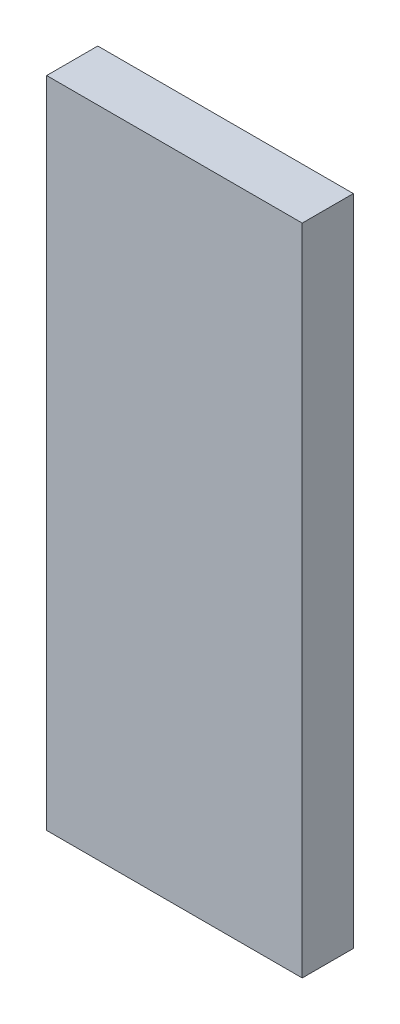
ISO-10303-21;
HEADER;
FILE_DESCRIPTION(('STEP AP214'),'2;1');
FILE_NAME('part.step','',(''),(''),'','','');
FILE_SCHEMA(('AUTOMOTIVE_DESIGN { 1 0 10303 214 1 1 1 1 }'));
ENDSEC;
DATA;
#1=APPLICATION_CONTEXT('core data for automotive mechanical design processes');
#2=APPLICATION_PROTOCOL_DEFINITION('international standard','automotive_design',2000,#1);
#3=PRODUCT_CONTEXT('',#1,'mechanical');
#4=PRODUCT('Part','Part','',(#3));
#5=PRODUCT_RELATED_PRODUCT_CATEGORY('part','',(#4));
#6=PRODUCT_DEFINITION_FORMATION('','',#4);
#7=PRODUCT_DEFINITION_CONTEXT('part definition',#1,'design');
#8=PRODUCT_DEFINITION('design','',#6,#7);
#9=PRODUCT_DEFINITION_SHAPE('','',#8);
#10=(LENGTH_UNIT() NAMED_UNIT(*) SI_UNIT(.MILLI.,.METRE.));
#11=(NAMED_UNIT(*) PLANE_ANGLE_UNIT() SI_UNIT($,.RADIAN.));
#12=(NAMED_UNIT(*) SI_UNIT($,.STERADIAN.) SOLID_ANGLE_UNIT());
#13=UNCERTAINTY_MEASURE_WITH_UNIT(LENGTH_MEASURE(1.E-05),#10,'distance_accuracy_value','');
#14=(GEOMETRIC_REPRESENTATION_CONTEXT(3) GLOBAL_UNCERTAINTY_ASSIGNED_CONTEXT((#13)) GLOBAL_UNIT_ASSIGNED_CONTEXT((#10,
#11,#12)) REPRESENTATION_CONTEXT('',''));
#15=CARTESIAN_POINT('',(0.,0.,0.));
#16=DIRECTION('',(0.,0.,1.));
#17=DIRECTION('',(1.,0.,0.));
#18=AXIS2_PLACEMENT_3D('',#15,#16,#17);
#19=CARTESIAN_POINT('',(0.67499992,-1.72667676,0.));
#20=DIRECTION('',(-1.,0.,0.));
#21=DIRECTION('',(0.,1.,0.));
#22=AXIS2_PLACEMENT_3D('',#19,#20,#21);
#23=PLANE('',#22);
#24=DIRECTION('',(0.,1.,0.));
#25=VECTOR('',#24,1.);
#26=CARTESIAN_POINT('',(0.67499992,-1.72667676,0.));
#27=LINE('',#26,#25);
#28=CARTESIAN_POINT('',(0.67499992,-1.72667676,0.));
#29=VERTEX_POINT('',#28);
#30=CARTESIAN_POINT('',(0.67499992,1.7266793,0.));
#31=VERTEX_POINT('',#30);
#32=EDGE_CURVE('E11',#29,#31,#27,.T.);
#33=ORIENTED_EDGE('',*,*,#32,.T.);
#34=DIRECTION('',(0.,0.,1.));
#35=VECTOR('',#34,1.);
#36=CARTESIAN_POINT('',(0.67499992,1.7266793,0.));
#37=LINE('',#36,#35);
#38=CARTESIAN_POINT('',(0.67499992,1.7266793,0.26999946));
#39=VERTEX_POINT('',#38);
#40=EDGE_CURVE('E24',#31,#39,#37,.T.);
#41=ORIENTED_EDGE('',*,*,#40,.T.);
#42=DIRECTION('',(0.,1.,0.));
#43=VECTOR('',#42,1.);
#44=CARTESIAN_POINT('',(0.67499992,-1.72667676,0.26999946));
#45=LINE('',#44,#43);
#46=CARTESIAN_POINT('',(0.67499992,-1.72667676,0.26999946));
#47=VERTEX_POINT('',#46);
#48=EDGE_CURVE('E87',#47,#39,#45,.T.);
#49=ORIENTED_EDGE('',*,*,#48,.F.);
#50=DIRECTION('',(0.,0.,1.));
#51=VECTOR('',#50,1.);
#52=CARTESIAN_POINT('',(0.67499992,-1.72667676,0.));
#53=LINE('',#52,#51);
#54=EDGE_CURVE('E36',#29,#47,#53,.T.);
#55=ORIENTED_EDGE('',*,*,#54,.F.);
#56=EDGE_LOOP('',(#33,#41,#49,#55));
#57=FACE_BOUND('',#56,.T.);
#58=ADVANCED_FACE('F17',(#57),#23,.F.);
#59=CARTESIAN_POINT('',(0.67499992,1.7266793,0.));
#60=DIRECTION('',(0.,-1.,0.));
#61=DIRECTION('',(-1.,0.,0.));
#62=AXIS2_PLACEMENT_3D('',#59,#60,#61);
#63=PLANE('',#62);
#64=DIRECTION('',(-1.,0.,0.));
#65=VECTOR('',#64,1.);
#66=CARTESIAN_POINT('',(0.67499992,1.7266793,0.));
#67=LINE('',#66,#65);
#68=CARTESIAN_POINT('',(-0.67499992,1.7266793,0.));
#69=VERTEX_POINT('',#68);
#70=EDGE_CURVE('E84',#31,#69,#67,.T.);
#71=ORIENTED_EDGE('',*,*,#70,.T.);
#72=DIRECTION('',(0.,0.,1.));
#73=VECTOR('',#72,1.);
#74=CARTESIAN_POINT('',(-0.67499992,1.7266793,0.));
#75=LINE('',#74,#73);
#76=CARTESIAN_POINT('',(-0.67499992,1.7266793,0.26999946));
#77=VERTEX_POINT('',#76);
#78=EDGE_CURVE('E82',#69,#77,#75,.T.);
#79=ORIENTED_EDGE('',*,*,#78,.T.);
#80=DIRECTION('',(-1.,0.,0.));
#81=VECTOR('',#80,1.);
#82=CARTESIAN_POINT('',(0.67499992,1.7266793,0.26999946));
#83=LINE('',#82,#81);
#84=EDGE_CURVE('E62',#39,#77,#83,.T.);
#85=ORIENTED_EDGE('',*,*,#84,.F.);
#86=ORIENTED_EDGE('',*,*,#40,.F.);
#87=EDGE_LOOP('',(#71,#79,#85,#86));
#88=FACE_BOUND('',#87,.T.);
#89=ADVANCED_FACE('F89',(#88),#63,.F.);
#90=CARTESIAN_POINT('',(-0.67499992,1.7266793,0.));
#91=DIRECTION('',(1.,0.,0.));
#92=DIRECTION('',(0.,-1.,0.));
#93=AXIS2_PLACEMENT_3D('',#90,#91,#92);
#94=PLANE('',#93);
#95=DIRECTION('',(0.,-1.,0.));
#96=VECTOR('',#95,1.);
#97=CARTESIAN_POINT('',(-0.67499992,1.7266793,0.));
#98=LINE('',#97,#96);
#99=CARTESIAN_POINT('',(-0.67499992,-1.72667676,0.));
#100=VERTEX_POINT('',#99);
#101=EDGE_CURVE('E71',#69,#100,#98,.T.);
#102=ORIENTED_EDGE('',*,*,#101,.T.);
#103=DIRECTION('',(0.,0.,1.));
#104=VECTOR('',#103,1.);
#105=CARTESIAN_POINT('',(-0.67499992,-1.72667676,0.));
#106=LINE('',#105,#104);
#107=CARTESIAN_POINT('',(-0.67499992,-1.72667676,0.26999946));
#108=VERTEX_POINT('',#107);
#109=EDGE_CURVE('E65',#100,#108,#106,.T.);
#110=ORIENTED_EDGE('',*,*,#109,.T.);
#111=DIRECTION('',(0.,-1.,0.));
#112=VECTOR('',#111,1.);
#113=CARTESIAN_POINT('',(-0.67499992,1.7266793,0.26999946));
#114=LINE('',#113,#112);
#115=EDGE_CURVE('E57',#77,#108,#114,.T.);
#116=ORIENTED_EDGE('',*,*,#115,.F.);
#117=ORIENTED_EDGE('',*,*,#78,.F.);
#118=EDGE_LOOP('',(#102,#110,#116,#117));
#119=FACE_BOUND('',#118,.T.);
#120=ADVANCED_FACE('F69',(#119),#94,.F.);
#121=CARTESIAN_POINT('',(-0.67499992,-1.72667676,0.));
#122=DIRECTION('',(0.,1.,0.));
#123=DIRECTION('',(1.,0.,0.));
#124=AXIS2_PLACEMENT_3D('',#121,#122,#123);
#125=PLANE('',#124);
#126=DIRECTION('',(1.,0.,0.));
#127=VECTOR('',#126,1.);
#128=CARTESIAN_POINT('',(-0.67499992,-1.72667676,0.));
#129=LINE('',#128,#127);
#130=EDGE_CURVE('E66',#100,#29,#129,.T.);
#131=ORIENTED_EDGE('',*,*,#130,.T.);
#132=ORIENTED_EDGE('',*,*,#54,.T.);
#133=DIRECTION('',(1.,0.,0.));
#134=VECTOR('',#133,1.);
#135=CARTESIAN_POINT('',(-0.67499992,-1.72667676,0.26999946));
#136=LINE('',#135,#134);
#137=EDGE_CURVE('E61',#108,#47,#136,.T.);
#138=ORIENTED_EDGE('',*,*,#137,.F.);
#139=ORIENTED_EDGE('',*,*,#109,.F.);
#140=EDGE_LOOP('',(#131,#132,#138,#139));
#141=FACE_BOUND('',#140,.T.);
#142=ADVANCED_FACE('F76',(#141),#125,.F.);
#143=CARTESIAN_POINT('',(0.,1.26999999845E-06,0.));
#144=DIRECTION('',(0.,0.,1.));
#145=DIRECTION('',(1.,0.,0.));
#146=AXIS2_PLACEMENT_3D('',#143,#144,#145);
#147=PLANE('',#146);
#148=ORIENTED_EDGE('',*,*,#130,.F.);
#149=ORIENTED_EDGE('',*,*,#101,.F.);
#150=ORIENTED_EDGE('',*,*,#70,.F.);
#151=ORIENTED_EDGE('',*,*,#32,.F.);
#152=EDGE_LOOP('',(#148,#149,#150,#151));
#153=FACE_BOUND('',#152,.T.);
#154=ADVANCED_FACE('F91',(#153),#147,.F.);
#155=CARTESIAN_POINT('',(0.,1.26999999845E-06,0.26999946));
#156=DIRECTION('',(0.,0.,1.));
#157=DIRECTION('',(1.,0.,0.));
#158=AXIS2_PLACEMENT_3D('',#155,#156,#157);
#159=PLANE('',#158);
#160=ORIENTED_EDGE('',*,*,#48,.T.);
#161=ORIENTED_EDGE('',*,*,#84,.T.);
#162=ORIENTED_EDGE('',*,*,#115,.T.);
#163=ORIENTED_EDGE('',*,*,#137,.T.);
#164=EDGE_LOOP('',(#160,#161,#162,#163));
#165=FACE_BOUND('',#164,.T.);
#166=ADVANCED_FACE('F59',(#165),#159,.T.);
#167=CLOSED_SHELL('',(#58,#89,#120,#142,#154,#166));
#168=MANIFOLD_SOLID_BREP('B1',#167);
#169=ADVANCED_BREP_SHAPE_REPRESENTATION('',(#18,#168),#14);
#170=SHAPE_DEFINITION_REPRESENTATION(#9,#169);
ENDSEC;
END-ISO-10303-21;
